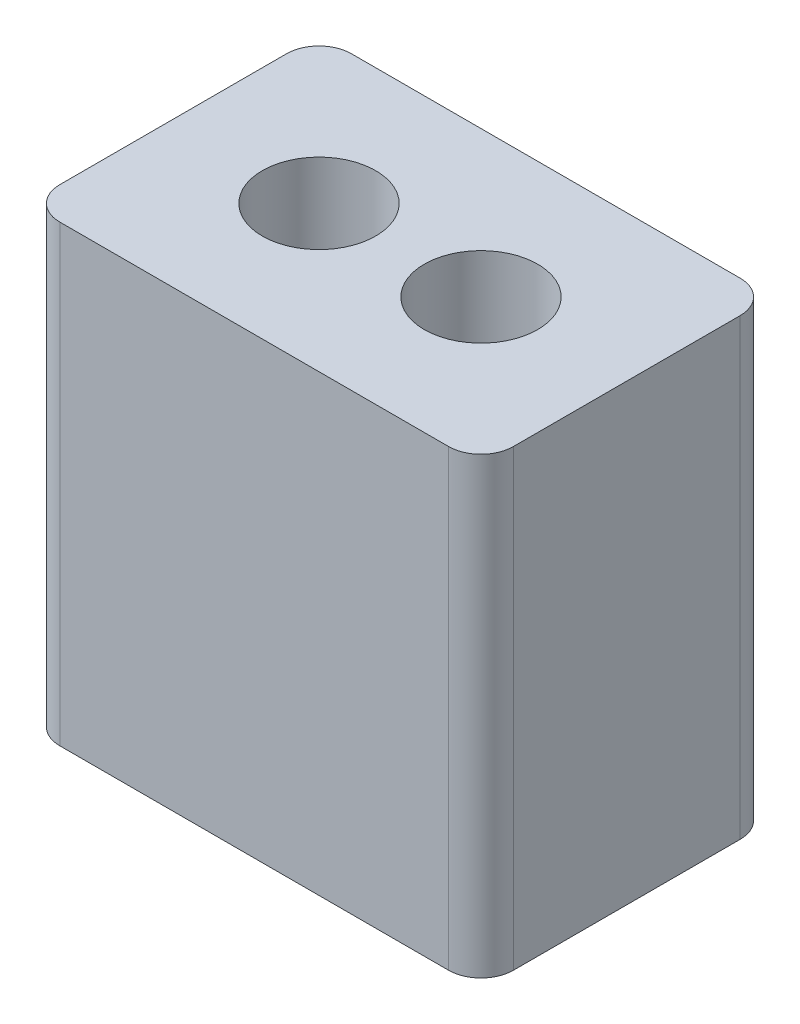
ISO-10303-21;
HEADER;
FILE_DESCRIPTION(('STEP AP214'),'2;1');
FILE_NAME('part.step','',(''),(''),'','','');
FILE_SCHEMA(('AUTOMOTIVE_DESIGN { 1 0 10303 214 1 1 1 1 }'));
ENDSEC;
DATA;
#1=APPLICATION_CONTEXT('core data for automotive mechanical design processes');
#2=APPLICATION_PROTOCOL_DEFINITION('international standard','automotive_design',2000,#1);
#3=PRODUCT_CONTEXT('',#1,'mechanical');
#4=PRODUCT('Part','Part','',(#3));
#5=PRODUCT_RELATED_PRODUCT_CATEGORY('part','',(#4));
#6=PRODUCT_DEFINITION_FORMATION('','',#4);
#7=PRODUCT_DEFINITION_CONTEXT('part definition',#1,'design');
#8=PRODUCT_DEFINITION('design','',#6,#7);
#9=PRODUCT_DEFINITION_SHAPE('','',#8);
#10=(LENGTH_UNIT() NAMED_UNIT(*) SI_UNIT(.MILLI.,.METRE.));
#11=(NAMED_UNIT(*) PLANE_ANGLE_UNIT() SI_UNIT($,.RADIAN.));
#12=(NAMED_UNIT(*) SI_UNIT($,.STERADIAN.) SOLID_ANGLE_UNIT());
#13=UNCERTAINTY_MEASURE_WITH_UNIT(LENGTH_MEASURE(1.E-05),#10,'distance_accuracy_value','');
#14=(GEOMETRIC_REPRESENTATION_CONTEXT(3) GLOBAL_UNCERTAINTY_ASSIGNED_CONTEXT((#13)) GLOBAL_UNIT_ASSIGNED_CONTEXT((#10,
#11,#12)) REPRESENTATION_CONTEXT('',''));
#15=CARTESIAN_POINT('',(0.,0.,0.));
#16=DIRECTION('',(0.,0.,1.));
#17=DIRECTION('',(1.,0.,0.));
#18=AXIS2_PLACEMENT_3D('',#15,#16,#17);
#19=CARTESIAN_POINT('',(7.,14.,-4.5));
#20=DIRECTION('',(-1.,0.,0.));
#21=DIRECTION('',(0.,0.,1.));
#22=AXIS2_PLACEMENT_3D('',#19,#20,#21);
#23=PLANE('',#22);
#24=DIRECTION('',(0.,0.,-1.));
#25=VECTOR('',#24,1.);
#26=CARTESIAN_POINT('',(7.,0.,-4.5));
#27=LINE('',#26,#25);
#28=CARTESIAN_POINT('',(7.,0.,3.5));
#29=VERTEX_POINT('',#28);
#30=CARTESIAN_POINT('',(7.,0.,-3.5));
#31=VERTEX_POINT('',#30);
#32=EDGE_CURVE('E130',#29,#31,#27,.T.);
#33=ORIENTED_EDGE('',*,*,#32,.T.);
#34=DIRECTION('',(0.,-1.,0.));
#35=VECTOR('',#34,1.);
#36=CARTESIAN_POINT('',(7.,14.,-3.5));
#37=LINE('',#36,#35);
#38=CARTESIAN_POINT('',(7.,14.,-3.5));
#39=VERTEX_POINT('',#38);
#40=EDGE_CURVE('E153',#31,#39,#37,.F.);
#41=ORIENTED_EDGE('',*,*,#40,.T.);
#42=DIRECTION('',(0.,0.,-1.));
#43=VECTOR('',#42,1.);
#44=CARTESIAN_POINT('',(7.,14.,-4.5));
#45=LINE('',#44,#43);
#46=CARTESIAN_POINT('',(7.,14.,3.5));
#47=VERTEX_POINT('',#46);
#48=EDGE_CURVE('E128',#47,#39,#45,.T.);
#49=ORIENTED_EDGE('',*,*,#48,.F.);
#50=DIRECTION('',(0.,-1.,0.));
#51=VECTOR('',#50,1.);
#52=CARTESIAN_POINT('',(7.,14.,3.5));
#53=LINE('',#52,#51);
#54=EDGE_CURVE('E150',#47,#29,#53,.T.);
#55=ORIENTED_EDGE('',*,*,#54,.T.);
#56=EDGE_LOOP('',(#33,#41,#49,#55));
#57=FACE_BOUND('',#56,.T.);
#58=ADVANCED_FACE('F35',(#57),#23,.F.);
#59=CARTESIAN_POINT('',(-7.,14.,-4.5));
#60=DIRECTION('',(0.,0.,1.));
#61=DIRECTION('',(1.,0.,0.));
#62=AXIS2_PLACEMENT_3D('',#59,#60,#61);
#63=PLANE('',#62);
#64=DIRECTION('',(-1.,0.,0.));
#65=VECTOR('',#64,1.);
#66=CARTESIAN_POINT('',(-7.,0.,-4.5));
#67=LINE('',#66,#65);
#68=CARTESIAN_POINT('',(6.,0.,-4.5));
#69=VERTEX_POINT('',#68);
#70=CARTESIAN_POINT('',(-6.,0.,-4.5));
#71=VERTEX_POINT('',#70);
#72=EDGE_CURVE('E126',#69,#71,#67,.T.);
#73=ORIENTED_EDGE('',*,*,#72,.T.);
#74=DIRECTION('',(0.,-1.,0.));
#75=VECTOR('',#74,1.);
#76=CARTESIAN_POINT('',(-6.,14.,-4.5));
#77=LINE('',#76,#75);
#78=CARTESIAN_POINT('',(-6.,14.,-4.5));
#79=VERTEX_POINT('',#78);
#80=EDGE_CURVE('E105',#71,#79,#77,.F.);
#81=ORIENTED_EDGE('',*,*,#80,.T.);
#82=DIRECTION('',(-1.,0.,0.));
#83=VECTOR('',#82,1.);
#84=CARTESIAN_POINT('',(-7.,14.,-4.5));
#85=LINE('',#84,#83);
#86=CARTESIAN_POINT('',(6.,14.,-4.5));
#87=VERTEX_POINT('',#86);
#88=EDGE_CURVE('E169',#87,#79,#85,.T.);
#89=ORIENTED_EDGE('',*,*,#88,.F.);
#90=DIRECTION('',(0.,-1.,0.));
#91=VECTOR('',#90,1.);
#92=CARTESIAN_POINT('',(6.,14.,-4.5));
#93=LINE('',#92,#91);
#94=EDGE_CURVE('E110',#87,#69,#93,.T.);
#95=ORIENTED_EDGE('',*,*,#94,.T.);
#96=EDGE_LOOP('',(#73,#81,#89,#95));
#97=FACE_BOUND('',#96,.T.);
#98=ADVANCED_FACE('F203',(#97),#63,.F.);
#99=CARTESIAN_POINT('',(-7.,14.,-4.5));
#100=DIRECTION('',(1.,0.,0.));
#101=DIRECTION('',(0.,0.,-1.));
#102=AXIS2_PLACEMENT_3D('',#99,#100,#101);
#103=PLANE('',#102);
#104=DIRECTION('',(0.,0.,1.));
#105=VECTOR('',#104,1.);
#106=CARTESIAN_POINT('',(-7.,14.,-4.5));
#107=LINE('',#106,#105);
#108=CARTESIAN_POINT('',(-7.,14.,-3.5));
#109=VERTEX_POINT('',#108);
#110=CARTESIAN_POINT('',(-7.,14.,3.5));
#111=VERTEX_POINT('',#110);
#112=EDGE_CURVE('E119',#109,#111,#107,.T.);
#113=ORIENTED_EDGE('',*,*,#112,.F.);
#114=DIRECTION('',(0.,-1.,0.));
#115=VECTOR('',#114,1.);
#116=CARTESIAN_POINT('',(-7.,14.,-3.5));
#117=LINE('',#116,#115);
#118=CARTESIAN_POINT('',(-7.,0.,-3.5));
#119=VERTEX_POINT('',#118);
#120=EDGE_CURVE('E104',#109,#119,#117,.T.);
#121=ORIENTED_EDGE('',*,*,#120,.T.);
#122=DIRECTION('',(0.,0.,1.));
#123=VECTOR('',#122,1.);
#124=CARTESIAN_POINT('',(-7.,0.,-4.5));
#125=LINE('',#124,#123);
#126=CARTESIAN_POINT('',(-7.,0.,3.5));
#127=VERTEX_POINT('',#126);
#128=EDGE_CURVE('E117',#119,#127,#125,.T.);
#129=ORIENTED_EDGE('',*,*,#128,.T.);
#130=DIRECTION('',(0.,-1.,0.));
#131=VECTOR('',#130,1.);
#132=CARTESIAN_POINT('',(-7.,14.,3.5));
#133=LINE('',#132,#131);
#134=EDGE_CURVE('E121',#127,#111,#133,.F.);
#135=ORIENTED_EDGE('',*,*,#134,.T.);
#136=EDGE_LOOP('',(#113,#121,#129,#135));
#137=FACE_BOUND('',#136,.T.);
#138=ADVANCED_FACE('F116',(#137),#103,.F.);
#139=CARTESIAN_POINT('',(-7.,14.,4.5));
#140=DIRECTION('',(0.,0.,-1.));
#141=DIRECTION('',(-1.,0.,0.));
#142=AXIS2_PLACEMENT_3D('',#139,#140,#141);
#143=PLANE('',#142);
#144=DIRECTION('',(1.,0.,0.));
#145=VECTOR('',#144,1.);
#146=CARTESIAN_POINT('',(-7.,0.,4.5));
#147=LINE('',#146,#145);
#148=CARTESIAN_POINT('',(-6.,0.,4.5));
#149=VERTEX_POINT('',#148);
#150=CARTESIAN_POINT('',(6.,0.,4.5));
#151=VERTEX_POINT('',#150);
#152=EDGE_CURVE('E125',#149,#151,#147,.T.);
#153=ORIENTED_EDGE('',*,*,#152,.T.);
#154=DIRECTION('',(0.,-1.,0.));
#155=VECTOR('',#154,1.);
#156=CARTESIAN_POINT('',(6.,14.,4.5));
#157=LINE('',#156,#155);
#158=CARTESIAN_POINT('',(6.,14.,4.5));
#159=VERTEX_POINT('',#158);
#160=EDGE_CURVE('E11',#151,#159,#157,.F.);
#161=ORIENTED_EDGE('',*,*,#160,.T.);
#162=DIRECTION('',(1.,0.,0.));
#163=VECTOR('',#162,1.);
#164=CARTESIAN_POINT('',(-7.,14.,4.5));
#165=LINE('',#164,#163);
#166=CARTESIAN_POINT('',(-6.,14.,4.5));
#167=VERTEX_POINT('',#166);
#168=EDGE_CURVE('E134',#167,#159,#165,.T.);
#169=ORIENTED_EDGE('',*,*,#168,.F.);
#170=DIRECTION('',(0.,-1.,0.));
#171=VECTOR('',#170,1.);
#172=CARTESIAN_POINT('',(-6.,14.,4.5));
#173=LINE('',#172,#171);
#174=EDGE_CURVE('E43',#167,#149,#173,.T.);
#175=ORIENTED_EDGE('',*,*,#174,.T.);
#176=EDGE_LOOP('',(#153,#161,#169,#175));
#177=FACE_BOUND('',#176,.T.);
#178=ADVANCED_FACE('F156',(#177),#143,.F.);
#179=CARTESIAN_POINT('',(0.,14.,0.));
#180=DIRECTION('',(0.,1.,0.));
#181=DIRECTION('',(0.,0.,1.));
#182=AXIS2_PLACEMENT_3D('',#179,#180,#181);
#183=PLANE('',#182);
#184=CARTESIAN_POINT('',(2.5,14.,0.));
#185=DIRECTION('',(0.,1.,0.));
#186=DIRECTION('',(0.,0.,-1.));
#187=AXIS2_PLACEMENT_3D('',#184,#185,#186);
#188=CIRCLE('',#187,1.75);
#189=CARTESIAN_POINT('',(2.5,14.,1.75));
#190=VERTEX_POINT('',#189);
#191=EDGE_CURVE('E187',#190,#190,#188,.T.);
#192=ORIENTED_EDGE('',*,*,#191,.F.);
#193=EDGE_LOOP('',(#192));
#194=FACE_BOUND('',#193,.T.);
#195=CARTESIAN_POINT('',(-2.5,14.,0.));
#196=DIRECTION('',(0.,1.,0.));
#197=DIRECTION('',(0.,0.,1.));
#198=AXIS2_PLACEMENT_3D('',#195,#196,#197);
#199=CIRCLE('',#198,1.75);
#200=CARTESIAN_POINT('',(-2.5,14.,1.75));
#201=VERTEX_POINT('',#200);
#202=EDGE_CURVE('E179',#201,#201,#199,.T.);
#203=ORIENTED_EDGE('',*,*,#202,.F.);
#204=EDGE_LOOP('',(#203));
#205=FACE_BOUND('',#204,.T.);
#206=ORIENTED_EDGE('',*,*,#88,.T.);
#207=CARTESIAN_POINT('',(-6.,14.,-3.5));
#208=DIRECTION('',(0.,1.,0.));
#209=DIRECTION('',(0.,0.,1.));
#210=AXIS2_PLACEMENT_3D('',#207,#208,#209);
#211=CIRCLE('',#210,1.);
#212=EDGE_CURVE('E148',#79,#109,#211,.T.);
#213=ORIENTED_EDGE('',*,*,#212,.T.);
#214=ORIENTED_EDGE('',*,*,#112,.T.);
#215=CARTESIAN_POINT('',(-6.,14.,3.5));
#216=DIRECTION('',(0.,1.,0.));
#217=DIRECTION('',(0.,0.,1.));
#218=AXIS2_PLACEMENT_3D('',#215,#216,#217);
#219=CIRCLE('',#218,1.);
#220=EDGE_CURVE('E55',#111,#167,#219,.T.);
#221=ORIENTED_EDGE('',*,*,#220,.T.);
#222=ORIENTED_EDGE('',*,*,#168,.T.);
#223=CARTESIAN_POINT('',(6.,14.,3.5));
#224=DIRECTION('',(0.,1.,0.));
#225=DIRECTION('',(0.,0.,1.));
#226=AXIS2_PLACEMENT_3D('',#223,#224,#225);
#227=CIRCLE('',#226,1.);
#228=EDGE_CURVE('E144',#159,#47,#227,.T.);
#229=ORIENTED_EDGE('',*,*,#228,.T.);
#230=ORIENTED_EDGE('',*,*,#48,.T.);
#231=CARTESIAN_POINT('',(6.,14.,-3.5));
#232=DIRECTION('',(0.,1.,0.));
#233=DIRECTION('',(0.,0.,1.));
#234=AXIS2_PLACEMENT_3D('',#231,#232,#233);
#235=CIRCLE('',#234,1.);
#236=EDGE_CURVE('E146',#39,#87,#235,.T.);
#237=ORIENTED_EDGE('',*,*,#236,.T.);
#238=EDGE_LOOP('',(#206,#213,#214,#221,#222,#229,#230,#237));
#239=FACE_BOUND('',#238,.T.);
#240=ADVANCED_FACE('F196',(#194,#205,#239),#183,.T.);
#241=CARTESIAN_POINT('',(0.,0.,0.));
#242=DIRECTION('',(0.,1.,0.));
#243=DIRECTION('',(0.,0.,1.));
#244=AXIS2_PLACEMENT_3D('',#241,#242,#243);
#245=PLANE('',#244);
#246=CARTESIAN_POINT('',(2.5,0.,0.));
#247=DIRECTION('',(0.,1.,0.));
#248=DIRECTION('',(0.,0.,1.));
#249=AXIS2_PLACEMENT_3D('',#246,#247,#248);
#250=CIRCLE('',#249,1.75);
#251=CARTESIAN_POINT('',(2.5,0.,1.75));
#252=VERTEX_POINT('',#251);
#253=EDGE_CURVE('E183',#252,#252,#250,.F.);
#254=ORIENTED_EDGE('',*,*,#253,.F.);
#255=EDGE_LOOP('',(#254));
#256=FACE_BOUND('',#255,.T.);
#257=CARTESIAN_POINT('',(-2.5,0.,0.));
#258=DIRECTION('',(0.,1.,0.));
#259=DIRECTION('',(0.,0.,1.));
#260=AXIS2_PLACEMENT_3D('',#257,#258,#259);
#261=CIRCLE('',#260,1.75);
#262=CARTESIAN_POINT('',(-2.5,0.,1.75));
#263=VERTEX_POINT('',#262);
#264=EDGE_CURVE('E174',#263,#263,#261,.F.);
#265=ORIENTED_EDGE('',*,*,#264,.F.);
#266=EDGE_LOOP('',(#265));
#267=FACE_BOUND('',#266,.T.);
#268=ORIENTED_EDGE('',*,*,#128,.F.);
#269=CARTESIAN_POINT('',(-6.,0.,-3.5));
#270=DIRECTION('',(0.,1.,0.));
#271=DIRECTION('',(0.,0.,1.));
#272=AXIS2_PLACEMENT_3D('',#269,#270,#271);
#273=CIRCLE('',#272,1.);
#274=EDGE_CURVE('E100',#119,#71,#273,.F.);
#275=ORIENTED_EDGE('',*,*,#274,.T.);
#276=ORIENTED_EDGE('',*,*,#72,.F.);
#277=CARTESIAN_POINT('',(6.,0.,-3.5));
#278=DIRECTION('',(0.,1.,0.));
#279=DIRECTION('',(0.,0.,1.));
#280=AXIS2_PLACEMENT_3D('',#277,#278,#279);
#281=CIRCLE('',#280,1.);
#282=EDGE_CURVE('E111',#69,#31,#281,.F.);
#283=ORIENTED_EDGE('',*,*,#282,.T.);
#284=ORIENTED_EDGE('',*,*,#32,.F.);
#285=CARTESIAN_POINT('',(6.,0.,3.5));
#286=DIRECTION('',(0.,1.,0.));
#287=DIRECTION('',(0.,0.,1.));
#288=AXIS2_PLACEMENT_3D('',#285,#286,#287);
#289=CIRCLE('',#288,1.);
#290=EDGE_CURVE('E137',#29,#151,#289,.F.);
#291=ORIENTED_EDGE('',*,*,#290,.T.);
#292=ORIENTED_EDGE('',*,*,#152,.F.);
#293=CARTESIAN_POINT('',(-6.,0.,3.5));
#294=DIRECTION('',(0.,1.,0.));
#295=DIRECTION('',(0.,0.,1.));
#296=AXIS2_PLACEMENT_3D('',#293,#294,#295);
#297=CIRCLE('',#296,1.);
#298=EDGE_CURVE('E120',#149,#127,#297,.F.);
#299=ORIENTED_EDGE('',*,*,#298,.T.);
#300=EDGE_LOOP('',(#268,#275,#276,#283,#284,#291,#292,#299));
#301=FACE_BOUND('',#300,.T.);
#302=ADVANCED_FACE('F123',(#256,#267,#301),#245,.F.);
#303=CARTESIAN_POINT('',(-6.,14.,-3.5));
#304=DIRECTION('',(0.,-1.,0.));
#305=DIRECTION('',(0.,0.,-1.));
#306=AXIS2_PLACEMENT_3D('',#303,#304,#305);
#307=CYLINDRICAL_SURFACE('',#306,1.);
#308=ORIENTED_EDGE('',*,*,#212,.F.);
#309=ORIENTED_EDGE('',*,*,#80,.F.);
#310=ORIENTED_EDGE('',*,*,#274,.F.);
#311=ORIENTED_EDGE('',*,*,#120,.F.);
#312=EDGE_LOOP('',(#308,#309,#310,#311));
#313=FACE_BOUND('',#312,.T.);
#314=ADVANCED_FACE('F103',(#313),#307,.T.);
#315=CARTESIAN_POINT('',(6.,14.,-3.5));
#316=DIRECTION('',(0.,-1.,0.));
#317=DIRECTION('',(0.,0.,-1.));
#318=AXIS2_PLACEMENT_3D('',#315,#316,#317);
#319=CYLINDRICAL_SURFACE('',#318,1.);
#320=ORIENTED_EDGE('',*,*,#236,.F.);
#321=ORIENTED_EDGE('',*,*,#40,.F.);
#322=ORIENTED_EDGE('',*,*,#282,.F.);
#323=ORIENTED_EDGE('',*,*,#94,.F.);
#324=EDGE_LOOP('',(#320,#321,#322,#323));
#325=FACE_BOUND('',#324,.T.);
#326=ADVANCED_FACE('F205',(#325),#319,.T.);
#327=CARTESIAN_POINT('',(6.,14.,3.5));
#328=DIRECTION('',(0.,-1.,0.));
#329=DIRECTION('',(0.,0.,-1.));
#330=AXIS2_PLACEMENT_3D('',#327,#328,#329);
#331=CYLINDRICAL_SURFACE('',#330,1.);
#332=ORIENTED_EDGE('',*,*,#228,.F.);
#333=ORIENTED_EDGE('',*,*,#160,.F.);
#334=ORIENTED_EDGE('',*,*,#290,.F.);
#335=ORIENTED_EDGE('',*,*,#54,.F.);
#336=EDGE_LOOP('',(#332,#333,#334,#335));
#337=FACE_BOUND('',#336,.T.);
#338=ADVANCED_FACE('F163',(#337),#331,.T.);
#339=CARTESIAN_POINT('',(-6.,14.,3.5));
#340=DIRECTION('',(0.,-1.,0.));
#341=DIRECTION('',(0.,0.,-1.));
#342=AXIS2_PLACEMENT_3D('',#339,#340,#341);
#343=CYLINDRICAL_SURFACE('',#342,1.);
#344=ORIENTED_EDGE('',*,*,#220,.F.);
#345=ORIENTED_EDGE('',*,*,#134,.F.);
#346=ORIENTED_EDGE('',*,*,#298,.F.);
#347=ORIENTED_EDGE('',*,*,#174,.F.);
#348=EDGE_LOOP('',(#344,#345,#346,#347));
#349=FACE_BOUND('',#348,.T.);
#350=ADVANCED_FACE('F37',(#349),#343,.T.);
#351=CARTESIAN_POINT('',(-2.5,-0.000999999999999265,0.));
#352=DIRECTION('',(0.,1.,0.));
#353=DIRECTION('',(0.,0.,1.));
#354=AXIS2_PLACEMENT_3D('',#351,#352,#353);
#355=CYLINDRICAL_SURFACE('',#354,1.75);
#356=CARTESIAN_POINT('',(-2.5,14.,1.75));
#357=CARTESIAN_POINT('',(-2.5,13.8541666666667,1.75));
#358=CARTESIAN_POINT('',(-2.5,13.7083333333333,1.75));
#359=CARTESIAN_POINT('',(-2.5,13.4166666666667,1.75));
#360=CARTESIAN_POINT('',(-2.5,13.2708333333333,1.75));
#361=CARTESIAN_POINT('',(-2.5,12.9791666666667,1.75));
#362=CARTESIAN_POINT('',(-2.5,12.8333333333333,1.75));
#363=CARTESIAN_POINT('',(-2.5,12.5416666666667,1.75));
#364=CARTESIAN_POINT('',(-2.5,12.3958333333333,1.75));
#365=CARTESIAN_POINT('',(-2.5,12.1041666666667,1.75));
#366=CARTESIAN_POINT('',(-2.5,11.9583333333333,1.75));
#367=CARTESIAN_POINT('',(-2.5,11.6666666666667,1.75));
#368=CARTESIAN_POINT('',(-2.5,11.5208333333333,1.75));
#369=CARTESIAN_POINT('',(-2.5,11.2291666666667,1.75));
#370=CARTESIAN_POINT('',(-2.5,11.0833333333333,1.75));
#371=CARTESIAN_POINT('',(-2.5,10.7916666666667,1.75));
#372=CARTESIAN_POINT('',(-2.5,10.6458333333333,1.75));
#373=CARTESIAN_POINT('',(-2.5,10.3541666666667,1.75));
#374=CARTESIAN_POINT('',(-2.5,10.2083333333333,1.75));
#375=CARTESIAN_POINT('',(-2.5,9.91666666666667,1.75));
#376=CARTESIAN_POINT('',(-2.5,9.77083333333333,1.75));
#377=CARTESIAN_POINT('',(-2.5,9.47916666666667,1.75));
#378=CARTESIAN_POINT('',(-2.5,9.33333333333333,1.75));
#379=CARTESIAN_POINT('',(-2.5,9.04166666666666,1.75));
#380=CARTESIAN_POINT('',(-2.5,8.89583333333333,1.75));
#381=CARTESIAN_POINT('',(-2.5,8.60416666666666,1.75));
#382=CARTESIAN_POINT('',(-2.5,8.45833333333333,1.75));
#383=CARTESIAN_POINT('',(-2.5,8.16666666666667,1.75));
#384=CARTESIAN_POINT('',(-2.5,8.02083333333333,1.75));
#385=CARTESIAN_POINT('',(-2.5,7.72916666666667,1.75));
#386=CARTESIAN_POINT('',(-2.5,7.58333333333333,1.75));
#387=CARTESIAN_POINT('',(-2.5,7.29166666666667,1.75));
#388=CARTESIAN_POINT('',(-2.5,7.14583333333333,1.75));
#389=CARTESIAN_POINT('',(-2.5,6.85416666666667,1.75));
#390=CARTESIAN_POINT('',(-2.5,6.70833333333333,1.75));
#391=CARTESIAN_POINT('',(-2.5,6.41666666666667,1.75));
#392=CARTESIAN_POINT('',(-2.5,6.27083333333333,1.75));
#393=CARTESIAN_POINT('',(-2.5,5.97916666666667,1.75));
#394=CARTESIAN_POINT('',(-2.5,5.83333333333333,1.75));
#395=CARTESIAN_POINT('',(-2.5,5.54166666666667,1.75));
#396=CARTESIAN_POINT('',(-2.5,5.39583333333333,1.75));
#397=CARTESIAN_POINT('',(-2.5,5.10416666666667,1.75));
#398=CARTESIAN_POINT('',(-2.5,4.95833333333333,1.75));
#399=CARTESIAN_POINT('',(-2.5,4.66666666666667,1.75));
#400=CARTESIAN_POINT('',(-2.5,4.52083333333333,1.75));
#401=CARTESIAN_POINT('',(-2.5,4.22916666666667,1.75));
#402=CARTESIAN_POINT('',(-2.5,4.08333333333333,1.75));
#403=CARTESIAN_POINT('',(-2.5,3.79166666666667,1.75));
#404=CARTESIAN_POINT('',(-2.5,3.64583333333333,1.75));
#405=CARTESIAN_POINT('',(-2.5,3.35416666666667,1.75));
#406=CARTESIAN_POINT('',(-2.5,3.20833333333333,1.75));
#407=CARTESIAN_POINT('',(-2.5,2.91666666666667,1.75));
#408=CARTESIAN_POINT('',(-2.5,2.77083333333333,1.75));
#409=CARTESIAN_POINT('',(-2.5,2.47916666666667,1.75));
#410=CARTESIAN_POINT('',(-2.5,2.33333333333333,1.75));
#411=CARTESIAN_POINT('',(-2.5,2.04166666666667,1.75));
#412=CARTESIAN_POINT('',(-2.5,1.89583333333333,1.75));
#413=CARTESIAN_POINT('',(-2.5,1.60416666666667,1.75));
#414=CARTESIAN_POINT('',(-2.5,1.45833333333333,1.75));
#415=CARTESIAN_POINT('',(-2.5,1.16666666666667,1.75));
#416=CARTESIAN_POINT('',(-2.5,1.02083333333333,1.75));
#417=CARTESIAN_POINT('',(-2.5,0.729166666666667,1.75));
#418=CARTESIAN_POINT('',(-2.5,0.583333333333334,1.75));
#419=CARTESIAN_POINT('',(-2.5,0.291666666666667,1.75));
#420=CARTESIAN_POINT('',(-2.5,0.145833333333333,1.75));
#421=CARTESIAN_POINT('',(-2.5,0.,1.75));
#422=B_SPLINE_CURVE_WITH_KNOTS('',3,(#356,#357,#358,#359,#360,#361,#362,#363,#364,#365,#366,
#367,#368,#369,#370,#371,#372,#373,#374,#375,#376,#377,#378,#379,#380,#381,#382,#383,#384,#385,
#386,#387,#388,#389,#390,#391,#392,#393,#394,#395,#396,#397,#398,#399,#400,#401,#402,#403,#404,
#405,#406,#407,#408,#409,#410,#411,#412,#413,#414,#415,#416,#417,#418,#419,#420,#421),
.UNSPECIFIED.,.F.,.F.,(4,2,2,2,2,2,2,2,2,2,2,2,2,2,2,2,2,2,2,2,2,2,2,2,2,2,2,2,2,2,2,2,4),(0.,
0.4375,0.875000000000001,1.3125,1.75,2.1875,2.625,3.0625,3.5,3.9375,4.375,4.8125,5.25,5.6875,
6.125,6.5625,7.,7.4375,7.875,8.3125,8.75,9.1875,9.625,10.0625,10.5,10.9375,11.375,11.8125,12.25,
12.6875,13.125,13.5625,14.),.UNSPECIFIED.);
#423=EDGE_CURVE('BSEAM227',#201,#263,#422,.T.);
#424=ORIENTED_EDGE('',*,*,#202,.T.);
#425=ORIENTED_EDGE('',*,*,#264,.T.);
#426=ORIENTED_EDGE('',*,*,#423,.T.);
#427=ORIENTED_EDGE('',*,*,#423,.F.);
#428=EDGE_LOOP('',(#424,#426,#425,#427));
#429=FACE_BOUND('',#428,.T.);
#430=ADVANCED_FACE('F227',(#429),#355,.F.);
#431=CARTESIAN_POINT('',(2.5,-0.000999999999999265,0.));
#432=DIRECTION('',(0.,1.,0.));
#433=DIRECTION('',(0.,0.,1.));
#434=AXIS2_PLACEMENT_3D('',#431,#432,#433);
#435=CYLINDRICAL_SURFACE('',#434,1.75);
#436=CARTESIAN_POINT('',(2.5,14.,1.75));
#437=CARTESIAN_POINT('',(2.5,13.8541666666667,1.75));
#438=CARTESIAN_POINT('',(2.5,13.7083333333333,1.75));
#439=CARTESIAN_POINT('',(2.5,13.4166666666667,1.75));
#440=CARTESIAN_POINT('',(2.5,13.2708333333333,1.75));
#441=CARTESIAN_POINT('',(2.5,12.9791666666667,1.75));
#442=CARTESIAN_POINT('',(2.5,12.8333333333333,1.75));
#443=CARTESIAN_POINT('',(2.5,12.5416666666667,1.75));
#444=CARTESIAN_POINT('',(2.5,12.3958333333333,1.75));
#445=CARTESIAN_POINT('',(2.5,12.1041666666667,1.75));
#446=CARTESIAN_POINT('',(2.5,11.9583333333333,1.75));
#447=CARTESIAN_POINT('',(2.5,11.6666666666667,1.75));
#448=CARTESIAN_POINT('',(2.5,11.5208333333333,1.75));
#449=CARTESIAN_POINT('',(2.5,11.2291666666667,1.75));
#450=CARTESIAN_POINT('',(2.5,11.0833333333333,1.75));
#451=CARTESIAN_POINT('',(2.5,10.7916666666667,1.75));
#452=CARTESIAN_POINT('',(2.5,10.6458333333333,1.75));
#453=CARTESIAN_POINT('',(2.5,10.3541666666667,1.75));
#454=CARTESIAN_POINT('',(2.5,10.2083333333333,1.75));
#455=CARTESIAN_POINT('',(2.5,9.91666666666667,1.75));
#456=CARTESIAN_POINT('',(2.5,9.77083333333333,1.75));
#457=CARTESIAN_POINT('',(2.5,9.47916666666667,1.75));
#458=CARTESIAN_POINT('',(2.5,9.33333333333333,1.75));
#459=CARTESIAN_POINT('',(2.5,9.04166666666666,1.75));
#460=CARTESIAN_POINT('',(2.5,8.89583333333333,1.75));
#461=CARTESIAN_POINT('',(2.5,8.60416666666666,1.75));
#462=CARTESIAN_POINT('',(2.5,8.45833333333333,1.75));
#463=CARTESIAN_POINT('',(2.5,8.16666666666667,1.75));
#464=CARTESIAN_POINT('',(2.5,8.02083333333333,1.75));
#465=CARTESIAN_POINT('',(2.5,7.72916666666667,1.75));
#466=CARTESIAN_POINT('',(2.5,7.58333333333333,1.75));
#467=CARTESIAN_POINT('',(2.5,7.29166666666667,1.75));
#468=CARTESIAN_POINT('',(2.5,7.14583333333333,1.75));
#469=CARTESIAN_POINT('',(2.5,6.85416666666667,1.75));
#470=CARTESIAN_POINT('',(2.5,6.70833333333333,1.75));
#471=CARTESIAN_POINT('',(2.5,6.41666666666667,1.75));
#472=CARTESIAN_POINT('',(2.5,6.27083333333333,1.75));
#473=CARTESIAN_POINT('',(2.5,5.97916666666667,1.75));
#474=CARTESIAN_POINT('',(2.5,5.83333333333333,1.75));
#475=CARTESIAN_POINT('',(2.5,5.54166666666667,1.75));
#476=CARTESIAN_POINT('',(2.5,5.39583333333333,1.75));
#477=CARTESIAN_POINT('',(2.5,5.10416666666667,1.75));
#478=CARTESIAN_POINT('',(2.5,4.95833333333333,1.75));
#479=CARTESIAN_POINT('',(2.5,4.66666666666667,1.75));
#480=CARTESIAN_POINT('',(2.5,4.52083333333333,1.75));
#481=CARTESIAN_POINT('',(2.5,4.22916666666667,1.75));
#482=CARTESIAN_POINT('',(2.5,4.08333333333333,1.75));
#483=CARTESIAN_POINT('',(2.5,3.79166666666667,1.75));
#484=CARTESIAN_POINT('',(2.5,3.64583333333333,1.75));
#485=CARTESIAN_POINT('',(2.5,3.35416666666667,1.75));
#486=CARTESIAN_POINT('',(2.5,3.20833333333333,1.75));
#487=CARTESIAN_POINT('',(2.5,2.91666666666667,1.75));
#488=CARTESIAN_POINT('',(2.5,2.77083333333333,1.75));
#489=CARTESIAN_POINT('',(2.5,2.47916666666667,1.75));
#490=CARTESIAN_POINT('',(2.5,2.33333333333333,1.75));
#491=CARTESIAN_POINT('',(2.5,2.04166666666667,1.75));
#492=CARTESIAN_POINT('',(2.5,1.89583333333333,1.75));
#493=CARTESIAN_POINT('',(2.5,1.60416666666667,1.75));
#494=CARTESIAN_POINT('',(2.5,1.45833333333333,1.75));
#495=CARTESIAN_POINT('',(2.5,1.16666666666667,1.75));
#496=CARTESIAN_POINT('',(2.5,1.02083333333333,1.75));
#497=CARTESIAN_POINT('',(2.5,0.729166666666667,1.75));
#498=CARTESIAN_POINT('',(2.5,0.583333333333334,1.75));
#499=CARTESIAN_POINT('',(2.5,0.291666666666667,1.75));
#500=CARTESIAN_POINT('',(2.5,0.145833333333333,1.75));
#501=CARTESIAN_POINT('',(2.5,0.,1.75));
#502=B_SPLINE_CURVE_WITH_KNOTS('',3,(#436,#437,#438,#439,#440,#441,#442,#443,#444,#445,#446,
#447,#448,#449,#450,#451,#452,#453,#454,#455,#456,#457,#458,#459,#460,#461,#462,#463,#464,#465,
#466,#467,#468,#469,#470,#471,#472,#473,#474,#475,#476,#477,#478,#479,#480,#481,#482,#483,#484,
#485,#486,#487,#488,#489,#490,#491,#492,#493,#494,#495,#496,#497,#498,#499,#500,#501),
.UNSPECIFIED.,.F.,.F.,(4,2,2,2,2,2,2,2,2,2,2,2,2,2,2,2,2,2,2,2,2,2,2,2,2,2,2,2,2,2,2,2,4),(0.,
0.4375,0.875000000000001,1.3125,1.75,2.1875,2.625,3.0625,3.5,3.9375,4.375,4.8125,5.25,5.6875,
6.125,6.5625,7.,7.4375,7.875,8.3125,8.75,9.1875,9.625,10.0625,10.5,10.9375,11.375,11.8125,12.25,
12.6875,13.125,13.5625,14.),.UNSPECIFIED.);
#503=EDGE_CURVE('BSEAM193',#190,#252,#502,.T.);
#504=ORIENTED_EDGE('',*,*,#191,.T.);
#505=ORIENTED_EDGE('',*,*,#253,.T.);
#506=ORIENTED_EDGE('',*,*,#503,.T.);
#507=ORIENTED_EDGE('',*,*,#503,.F.);
#508=EDGE_LOOP('',(#504,#506,#505,#507));
#509=FACE_BOUND('',#508,.T.);
#510=ADVANCED_FACE('F193',(#509),#435,.F.);
#511=CLOSED_SHELL('',(#58,#98,#138,#178,#240,#302,#314,#326,#338,#350,#430,#510));
#512=MANIFOLD_SOLID_BREP('B2',#511);
#513=ADVANCED_BREP_SHAPE_REPRESENTATION('',(#18,#512),#14);
#514=SHAPE_DEFINITION_REPRESENTATION(#9,#513);
ENDSEC;
END-ISO-10303-21;
